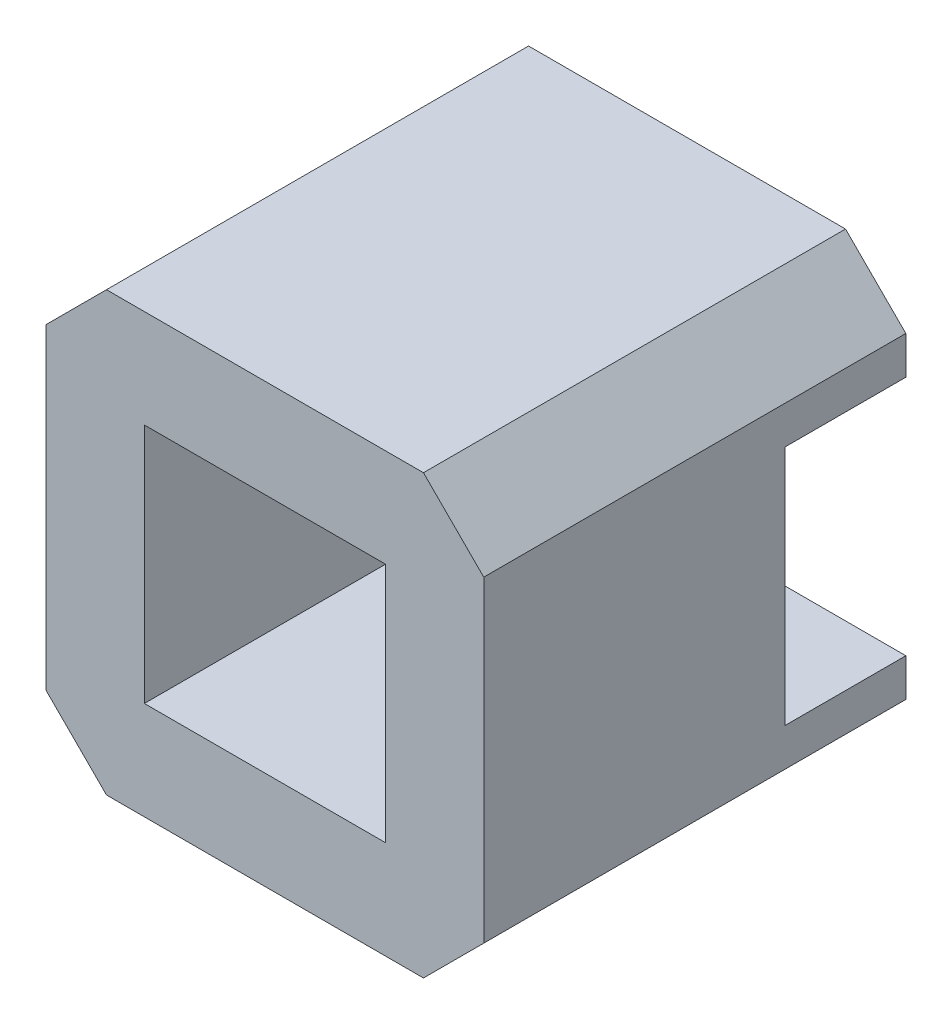
ISO-10303-21;
HEADER;
FILE_DESCRIPTION(('STEP AP214'),'2;1');
FILE_NAME('part.step','',(''),(''),'','','');
FILE_SCHEMA(('AUTOMOTIVE_DESIGN { 1 0 10303 214 1 1 1 1 }'));
ENDSEC;
DATA;
#1=APPLICATION_CONTEXT('core data for automotive mechanical design processes');
#2=APPLICATION_PROTOCOL_DEFINITION('international standard','automotive_design',2000,#1);
#3=PRODUCT_CONTEXT('',#1,'mechanical');
#4=PRODUCT('Part','Part','',(#3));
#5=PRODUCT_RELATED_PRODUCT_CATEGORY('part','',(#4));
#6=PRODUCT_DEFINITION_FORMATION('','',#4);
#7=PRODUCT_DEFINITION_CONTEXT('part definition',#1,'design');
#8=PRODUCT_DEFINITION('design','',#6,#7);
#9=PRODUCT_DEFINITION_SHAPE('','',#8);
#10=(LENGTH_UNIT() NAMED_UNIT(*) SI_UNIT(.MILLI.,.METRE.));
#11=(NAMED_UNIT(*) PLANE_ANGLE_UNIT() SI_UNIT($,.RADIAN.));
#12=(NAMED_UNIT(*) SI_UNIT($,.STERADIAN.) SOLID_ANGLE_UNIT());
#13=UNCERTAINTY_MEASURE_WITH_UNIT(LENGTH_MEASURE(1.E-05),#10,'distance_accuracy_value','');
#14=(GEOMETRIC_REPRESENTATION_CONTEXT(3) GLOBAL_UNCERTAINTY_ASSIGNED_CONTEXT((#13)) GLOBAL_UNIT_ASSIGNED_CONTEXT((#10,
#11,#12)) REPRESENTATION_CONTEXT('',''));
#15=CARTESIAN_POINT('',(0.,0.,0.));
#16=DIRECTION('',(0.,0.,1.));
#17=DIRECTION('',(1.,0.,0.));
#18=AXIS2_PLACEMENT_3D('',#15,#16,#17);
#19=CARTESIAN_POINT('',(-6.128826208725,29.409000078524,-11.75));
#20=DIRECTION('',(0.,0.,-1.));
#21=DIRECTION('',(0.,-1.,0.));
#22=AXIS2_PLACEMENT_3D('',#19,#20,#21);
#23=PLANE('',#22);
#24=DIRECTION('',(-1.,0.,0.));
#25=VECTOR('',#24,1.);
#26=CARTESIAN_POINT('',(-6.128826208725,28.709000078524,-11.75));
#27=LINE('',#26,#25);
#28=CARTESIAN_POINT('',(-4.858826208725,28.709000078524,-11.75));
#29=VERTEX_POINT('',#28);
#30=CARTESIAN_POINT('',(-5.428826208725,28.709000078524,-11.75));
#31=VERTEX_POINT('',#30);
#32=EDGE_CURVE('E181',#29,#31,#27,.T.);
#33=ORIENTED_EDGE('',*,*,#32,.T.);
#34=DIRECTION('',(0.,1.,0.));
#35=VECTOR('',#34,1.);
#36=CARTESIAN_POINT('',(-5.428826208725,29.409000078524,-11.75));
#37=LINE('',#36,#35);
#38=CARTESIAN_POINT('',(-5.428826208725,30.109000078524,-11.75));
#39=VERTEX_POINT('',#38);
#40=EDGE_CURVE('E217',#31,#39,#37,.T.);
#41=ORIENTED_EDGE('',*,*,#40,.T.);
#42=DIRECTION('',(-1.,0.,0.));
#43=VECTOR('',#42,1.);
#44=CARTESIAN_POINT('',(-6.128826208725,30.109000078524,-11.75));
#45=LINE('',#44,#43);
#46=CARTESIAN_POINT('',(-4.858826208725,30.109000078524,-11.75));
#47=VERTEX_POINT('',#46);
#48=EDGE_CURVE('E243',#47,#39,#45,.T.);
#49=ORIENTED_EDGE('',*,*,#48,.F.);
#50=DIRECTION('',(0.,-1.,0.));
#51=VECTOR('',#50,1.);
#52=CARTESIAN_POINT('',(-4.858826208725,29.409000078524,-11.75));
#53=LINE('',#52,#51);
#54=EDGE_CURVE('E250',#47,#29,#53,.T.);
#55=ORIENTED_EDGE('',*,*,#54,.T.);
#56=EDGE_LOOP('',(#33,#41,#49,#55));
#57=FACE_BOUND('',#56,.T.);
#58=ADVANCED_FACE('F17',(#57),#23,.T.);
#59=CARTESIAN_POINT('',(-6.128826208725,29.409000078524,-10.));
#60=DIRECTION('',(0.,0.,1.));
#61=DIRECTION('',(1.,0.,0.));
#62=AXIS2_PLACEMENT_3D('',#59,#60,#61);
#63=PLANE('',#62);
#64=DIRECTION('',(-1.,0.,0.));
#65=VECTOR('',#64,1.);
#66=CARTESIAN_POINT('',(-6.128826208725,30.679000078524,-10.));
#67=LINE('',#66,#65);
#68=CARTESIAN_POINT('',(-5.208826208725,30.679000078524,-10.));
#69=VERTEX_POINT('',#68);
#70=CARTESIAN_POINT('',(-7.048826208725,30.679000078524,-10.));
#71=VERTEX_POINT('',#70);
#72=EDGE_CURVE('E247',#69,#71,#67,.T.);
#73=ORIENTED_EDGE('',*,*,#72,.T.);
#74=DIRECTION('',(0.707106781186548,0.707106781186548,0.));
#75=VECTOR('',#74,1.);
#76=CARTESIAN_POINT('',(-7.223826208725,30.504000078524,-10.));
#77=LINE('',#76,#75);
#78=CARTESIAN_POINT('',(-7.398826208725,30.329000078524,-10.));
#79=VERTEX_POINT('',#78);
#80=EDGE_CURVE('E260',#79,#71,#77,.T.);
#81=ORIENTED_EDGE('',*,*,#80,.F.);
#82=DIRECTION('',(0.,-1.,0.));
#83=VECTOR('',#82,1.);
#84=CARTESIAN_POINT('',(-7.398826208725,29.409000078524,-10.));
#85=LINE('',#84,#83);
#86=CARTESIAN_POINT('',(-7.398826208725,28.489000078524,-10.));
#87=VERTEX_POINT('',#86);
#88=EDGE_CURVE('E251',#79,#87,#85,.T.);
#89=ORIENTED_EDGE('',*,*,#88,.T.);
#90=DIRECTION('',(0.707106781186548,-0.707106781186548,0.));
#91=VECTOR('',#90,1.);
#92=CARTESIAN_POINT('',(-7.223826208725,28.314000078524,-10.));
#93=LINE('',#92,#91);
#94=CARTESIAN_POINT('',(-7.048826208725,28.139000078524,-10.));
#95=VERTEX_POINT('',#94);
#96=EDGE_CURVE('E278',#87,#95,#93,.T.);
#97=ORIENTED_EDGE('',*,*,#96,.T.);
#98=DIRECTION('',(-1.,0.,0.));
#99=VECTOR('',#98,1.);
#100=CARTESIAN_POINT('',(-6.128826208725,28.139000078524,-10.));
#101=LINE('',#100,#99);
#102=CARTESIAN_POINT('',(-5.208826208725,28.139000078524,-10.));
#103=VERTEX_POINT('',#102);
#104=EDGE_CURVE('E334',#103,#95,#101,.T.);
#105=ORIENTED_EDGE('',*,*,#104,.F.);
#106=DIRECTION('',(-0.707106781186548,-0.707106781186548,0.));
#107=VECTOR('',#106,1.);
#108=CARTESIAN_POINT('',(-5.033826208725,28.314000078524,-10.));
#109=LINE('',#108,#107);
#110=CARTESIAN_POINT('',(-4.858826208725,28.489000078524,-10.));
#111=VERTEX_POINT('',#110);
#112=EDGE_CURVE('E231',#111,#103,#109,.T.);
#113=ORIENTED_EDGE('',*,*,#112,.F.);
#114=DIRECTION('',(0.,-1.,0.));
#115=VECTOR('',#114,1.);
#116=CARTESIAN_POINT('',(-4.858826208725,29.409000078524,-10.));
#117=LINE('',#116,#115);
#118=CARTESIAN_POINT('',(-4.858826208725,30.329000078524,-10.));
#119=VERTEX_POINT('',#118);
#120=EDGE_CURVE('E20',#119,#111,#117,.T.);
#121=ORIENTED_EDGE('',*,*,#120,.F.);
#122=DIRECTION('',(-0.707106781186548,0.707106781186548,0.));
#123=VECTOR('',#122,1.);
#124=CARTESIAN_POINT('',(-5.033826208725,30.504000078524,-10.));
#125=LINE('',#124,#123);
#126=EDGE_CURVE('E308',#119,#69,#125,.T.);
#127=ORIENTED_EDGE('',*,*,#126,.T.);
#128=EDGE_LOOP('',(#73,#81,#89,#97,#105,#113,#121,#127));
#129=FACE_BOUND('',#128,.T.);
#130=DIRECTION('',(-1.,0.,0.));
#131=VECTOR('',#130,1.);
#132=CARTESIAN_POINT('',(-6.128826208725,30.109000078524,-10.));
#133=LINE('',#132,#131);
#134=CARTESIAN_POINT('',(-5.428826208725,30.109000078524,-10.));
#135=VERTEX_POINT('',#134);
#136=CARTESIAN_POINT('',(-6.828826208725,30.109000078524,-10.));
#137=VERTEX_POINT('',#136);
#138=EDGE_CURVE('E239',#135,#137,#133,.T.);
#139=ORIENTED_EDGE('',*,*,#138,.F.);
#140=DIRECTION('',(0.,1.,0.));
#141=VECTOR('',#140,1.);
#142=CARTESIAN_POINT('',(-5.428826208725,29.409000078524,-10.));
#143=LINE('',#142,#141);
#144=CARTESIAN_POINT('',(-5.428826208725,28.709000078524,-10.));
#145=VERTEX_POINT('',#144);
#146=EDGE_CURVE('E175',#145,#135,#143,.T.);
#147=ORIENTED_EDGE('',*,*,#146,.F.);
#148=DIRECTION('',(-1.,0.,0.));
#149=VECTOR('',#148,1.);
#150=CARTESIAN_POINT('',(-6.128826208725,28.709000078524,-10.));
#151=LINE('',#150,#149);
#152=CARTESIAN_POINT('',(-6.828826208725,28.709000078524,-10.));
#153=VERTEX_POINT('',#152);
#154=EDGE_CURVE('E169',#145,#153,#151,.T.);
#155=ORIENTED_EDGE('',*,*,#154,.T.);
#156=DIRECTION('',(0.,1.,0.));
#157=VECTOR('',#156,1.);
#158=CARTESIAN_POINT('',(-6.828826208725,29.409000078524,-10.));
#159=LINE('',#158,#157);
#160=EDGE_CURVE('E172',#153,#137,#159,.T.);
#161=ORIENTED_EDGE('',*,*,#160,.T.);
#162=EDGE_LOOP('',(#139,#147,#155,#161));
#163=FACE_BOUND('',#162,.T.);
#164=ADVANCED_FACE('F171',(#129,#163),#63,.T.);
#165=CARTESIAN_POINT('',(-6.128826208725,29.409000078524,-12.45));
#166=DIRECTION('',(0.,0.,1.));
#167=DIRECTION('',(1.,0.,0.));
#168=AXIS2_PLACEMENT_3D('',#165,#166,#167);
#169=PLANE('',#168);
#170=DIRECTION('',(-1.,0.,0.));
#171=VECTOR('',#170,1.);
#172=CARTESIAN_POINT('',(-6.128826208725,28.709000078524,-12.45));
#173=LINE('',#172,#171);
#174=CARTESIAN_POINT('',(-4.858826208725,28.709000078524,-12.45));
#175=VERTEX_POINT('',#174);
#176=CARTESIAN_POINT('',(-7.398826208725,28.709000078524,-12.45));
#177=VERTEX_POINT('',#176);
#178=EDGE_CURVE('E257',#175,#177,#173,.T.);
#179=ORIENTED_EDGE('',*,*,#178,.F.);
#180=DIRECTION('',(0.,-1.,0.));
#181=VECTOR('',#180,1.);
#182=CARTESIAN_POINT('',(-4.858826208725,29.409000078524,-12.45));
#183=LINE('',#182,#181);
#184=CARTESIAN_POINT('',(-4.858826208725,28.489000078524,-12.45));
#185=VERTEX_POINT('',#184);
#186=EDGE_CURVE('E11',#175,#185,#183,.T.);
#187=ORIENTED_EDGE('',*,*,#186,.T.);
#188=DIRECTION('',(0.707106781186548,0.707106781186548,0.));
#189=VECTOR('',#188,1.);
#190=CARTESIAN_POINT('',(-4.858826208725,28.489000078524,-12.45));
#191=LINE('',#190,#189);
#192=CARTESIAN_POINT('',(-5.208826208725,28.139000078524,-12.45));
#193=VERTEX_POINT('',#192);
#194=EDGE_CURVE('E296',#193,#185,#191,.T.);
#195=ORIENTED_EDGE('',*,*,#194,.F.);
#196=DIRECTION('',(-1.,0.,0.));
#197=VECTOR('',#196,1.);
#198=CARTESIAN_POINT('',(-6.128826208725,28.139000078524,-12.45));
#199=LINE('',#198,#197);
#200=CARTESIAN_POINT('',(-7.048826208725,28.139000078524,-12.45));
#201=VERTEX_POINT('',#200);
#202=EDGE_CURVE('E331',#193,#201,#199,.T.);
#203=ORIENTED_EDGE('',*,*,#202,.T.);
#204=DIRECTION('',(-0.707106781186548,0.707106781186548,0.));
#205=VECTOR('',#204,1.);
#206=CARTESIAN_POINT('',(-7.048826208725,28.139000078524,-12.45));
#207=LINE('',#206,#205);
#208=CARTESIAN_POINT('',(-7.398826208725,28.489000078524,-12.45));
#209=VERTEX_POINT('',#208);
#210=EDGE_CURVE('E232',#201,#209,#207,.T.);
#211=ORIENTED_EDGE('',*,*,#210,.T.);
#212=DIRECTION('',(0.,-1.,0.));
#213=VECTOR('',#212,1.);
#214=CARTESIAN_POINT('',(-7.398826208725,29.409000078524,-12.45));
#215=LINE('',#214,#213);
#216=EDGE_CURVE('E337',#177,#209,#215,.T.);
#217=ORIENTED_EDGE('',*,*,#216,.F.);
#218=EDGE_LOOP('',(#179,#187,#195,#203,#211,#217));
#219=FACE_BOUND('',#218,.T.);
#220=ADVANCED_FACE('F368',(#219),#169,.F.);
#221=CARTESIAN_POINT('',(-4.858826208725,29.409000078524,-10.));
#222=DIRECTION('',(1.,0.,0.));
#223=DIRECTION('',(0.,1.,0.));
#224=AXIS2_PLACEMENT_3D('',#221,#222,#223);
#225=PLANE('',#224);
#226=ORIENTED_EDGE('',*,*,#54,.F.);
#227=DIRECTION('',(0.,0.,-1.));
#228=VECTOR('',#227,1.);
#229=CARTESIAN_POINT('',(-4.858826208725,30.109000078524,-11.75));
#230=LINE('',#229,#228);
#231=CARTESIAN_POINT('',(-4.858826208725,30.109000078524,-12.45));
#232=VERTEX_POINT('',#231);
#233=EDGE_CURVE('E238',#47,#232,#230,.T.);
#234=ORIENTED_EDGE('',*,*,#233,.T.);
#235=DIRECTION('',(0.,-1.,0.));
#236=VECTOR('',#235,1.);
#237=CARTESIAN_POINT('',(-4.858826208725,29.409000078524,-12.45));
#238=LINE('',#237,#236);
#239=CARTESIAN_POINT('',(-4.858826208725,30.329000078524,-12.45));
#240=VERTEX_POINT('',#239);
#241=EDGE_CURVE('E301',#240,#232,#238,.T.);
#242=ORIENTED_EDGE('',*,*,#241,.F.);
#243=DIRECTION('',(0.,0.,1.));
#244=VECTOR('',#243,1.);
#245=CARTESIAN_POINT('',(-4.858826208725,30.329000078524,-10.));
#246=LINE('',#245,#244);
#247=EDGE_CURVE('E311',#240,#119,#246,.T.);
#248=ORIENTED_EDGE('',*,*,#247,.T.);
#249=ORIENTED_EDGE('',*,*,#120,.T.);
#250=DIRECTION('',(0.,0.,-1.));
#251=VECTOR('',#250,1.);
#252=CARTESIAN_POINT('',(-4.858826208725,28.489000078524,-10.));
#253=LINE('',#252,#251);
#254=EDGE_CURVE('E300',#111,#185,#253,.T.);
#255=ORIENTED_EDGE('',*,*,#254,.T.);
#256=ORIENTED_EDGE('',*,*,#186,.F.);
#257=DIRECTION('',(0.,0.,-1.));
#258=VECTOR('',#257,1.);
#259=CARTESIAN_POINT('',(-4.858826208725,28.709000078524,-11.75));
#260=LINE('',#259,#258);
#261=EDGE_CURVE('E274',#29,#175,#260,.T.);
#262=ORIENTED_EDGE('',*,*,#261,.F.);
#263=EDGE_LOOP('',(#226,#234,#242,#248,#249,#255,#256,#262));
#264=FACE_BOUND('',#263,.T.);
#265=ADVANCED_FACE('F352',(#264),#225,.T.);
#266=CARTESIAN_POINT('',(-6.128826208725,30.679000078524,-10.));
#267=DIRECTION('',(0.,-1.,0.));
#268=DIRECTION('',(0.,0.,-1.));
#269=AXIS2_PLACEMENT_3D('',#266,#267,#268);
#270=PLANE('',#269);
#271=DIRECTION('',(-1.,0.,0.));
#272=VECTOR('',#271,1.);
#273=CARTESIAN_POINT('',(-6.128826208725,30.679000078524,-12.45));
#274=LINE('',#273,#272);
#275=CARTESIAN_POINT('',(-5.208826208725,30.679000078524,-12.45));
#276=VERTEX_POINT('',#275);
#277=CARTESIAN_POINT('',(-7.048826208725,30.679000078524,-12.45));
#278=VERTEX_POINT('',#277);
#279=EDGE_CURVE('E48',#276,#278,#274,.T.);
#280=ORIENTED_EDGE('',*,*,#279,.T.);
#281=DIRECTION('',(0.,0.,1.));
#282=VECTOR('',#281,1.);
#283=CARTESIAN_POINT('',(-7.048826208725,30.679000078524,-10.));
#284=LINE('',#283,#282);
#285=EDGE_CURVE('E264',#278,#71,#284,.T.);
#286=ORIENTED_EDGE('',*,*,#285,.T.);
#287=ORIENTED_EDGE('',*,*,#72,.F.);
#288=DIRECTION('',(0.,0.,-1.));
#289=VECTOR('',#288,1.);
#290=CARTESIAN_POINT('',(-5.208826208725,30.679000078524,-12.45));
#291=LINE('',#290,#289);
#292=EDGE_CURVE('E265',#69,#276,#291,.T.);
#293=ORIENTED_EDGE('',*,*,#292,.T.);
#294=EDGE_LOOP('',(#280,#286,#287,#293));
#295=FACE_BOUND('',#294,.T.);
#296=ADVANCED_FACE('F623',(#295),#270,.F.);
#297=CARTESIAN_POINT('',(-7.398826208725,29.409000078524,-10.));
#298=DIRECTION('',(1.,0.,0.));
#299=DIRECTION('',(0.,1.,0.));
#300=AXIS2_PLACEMENT_3D('',#297,#298,#299);
#301=PLANE('',#300);
#302=DIRECTION('',(0.,-1.,0.));
#303=VECTOR('',#302,1.);
#304=CARTESIAN_POINT('',(-7.398826208725,29.409000078524,-11.75));
#305=LINE('',#304,#303);
#306=CARTESIAN_POINT('',(-7.398826208725,30.109000078524,-11.75));
#307=VERTEX_POINT('',#306);
#308=CARTESIAN_POINT('',(-7.398826208725,28.709000078524,-11.75));
#309=VERTEX_POINT('',#308);
#310=EDGE_CURVE('E215',#307,#309,#305,.T.);
#311=ORIENTED_EDGE('',*,*,#310,.T.);
#312=DIRECTION('',(0.,0.,-1.));
#313=VECTOR('',#312,1.);
#314=CARTESIAN_POINT('',(-7.398826208725,28.709000078524,-11.75));
#315=LINE('',#314,#313);
#316=EDGE_CURVE('E182',#309,#177,#315,.T.);
#317=ORIENTED_EDGE('',*,*,#316,.T.);
#318=ORIENTED_EDGE('',*,*,#216,.T.);
#319=DIRECTION('',(0.,0.,1.));
#320=VECTOR('',#319,1.);
#321=CARTESIAN_POINT('',(-7.398826208725,28.489000078524,-10.));
#322=LINE('',#321,#320);
#323=EDGE_CURVE('E282',#209,#87,#322,.T.);
#324=ORIENTED_EDGE('',*,*,#323,.T.);
#325=ORIENTED_EDGE('',*,*,#88,.F.);
#326=DIRECTION('',(0.,0.,-1.));
#327=VECTOR('',#326,1.);
#328=CARTESIAN_POINT('',(-7.398826208725,30.329000078524,-10.));
#329=LINE('',#328,#327);
#330=CARTESIAN_POINT('',(-7.398826208725,30.329000078524,-12.45));
#331=VERTEX_POINT('',#330);
#332=EDGE_CURVE('E304',#79,#331,#329,.T.);
#333=ORIENTED_EDGE('',*,*,#332,.T.);
#334=DIRECTION('',(0.,-1.,0.));
#335=VECTOR('',#334,1.);
#336=CARTESIAN_POINT('',(-7.398826208725,29.409000078524,-12.45));
#337=LINE('',#336,#335);
#338=CARTESIAN_POINT('',(-7.398826208725,30.109000078524,-12.45));
#339=VERTEX_POINT('',#338);
#340=EDGE_CURVE('E38',#331,#339,#337,.T.);
#341=ORIENTED_EDGE('',*,*,#340,.T.);
#342=DIRECTION('',(0.,0.,-1.));
#343=VECTOR('',#342,1.);
#344=CARTESIAN_POINT('',(-7.398826208725,30.109000078524,-11.75));
#345=LINE('',#344,#343);
#346=EDGE_CURVE('E242',#307,#339,#345,.T.);
#347=ORIENTED_EDGE('',*,*,#346,.F.);
#348=EDGE_LOOP('',(#311,#317,#318,#324,#325,#333,#341,#347));
#349=FACE_BOUND('',#348,.T.);
#350=ADVANCED_FACE('F614',(#349),#301,.F.);
#351=CARTESIAN_POINT('',(-6.128826208725,28.139000078524,-10.));
#352=DIRECTION('',(0.,-1.,0.));
#353=DIRECTION('',(0.,0.,-1.));
#354=AXIS2_PLACEMENT_3D('',#351,#352,#353);
#355=PLANE('',#354);
#356=ORIENTED_EDGE('',*,*,#202,.F.);
#357=DIRECTION('',(0.,0.,1.));
#358=VECTOR('',#357,1.);
#359=CARTESIAN_POINT('',(-5.208826208725,28.139000078524,-10.));
#360=LINE('',#359,#358);
#361=EDGE_CURVE('E292',#193,#103,#360,.T.);
#362=ORIENTED_EDGE('',*,*,#361,.T.);
#363=ORIENTED_EDGE('',*,*,#104,.T.);
#364=DIRECTION('',(0.,0.,-1.));
#365=VECTOR('',#364,1.);
#366=CARTESIAN_POINT('',(-7.048826208725,28.139000078524,-12.45));
#367=LINE('',#366,#365);
#368=EDGE_CURVE('E227',#95,#201,#367,.T.);
#369=ORIENTED_EDGE('',*,*,#368,.T.);
#370=EDGE_LOOP('',(#356,#362,#363,#369));
#371=FACE_BOUND('',#370,.T.);
#372=ADVANCED_FACE('F364',(#371),#355,.T.);
#373=CARTESIAN_POINT('',(-6.128826208725,29.409000078524,-12.45));
#374=DIRECTION('',(0.,0.,1.));
#375=DIRECTION('',(1.,0.,0.));
#376=AXIS2_PLACEMENT_3D('',#373,#374,#375);
#377=PLANE('',#376);
#378=ORIENTED_EDGE('',*,*,#241,.T.);
#379=DIRECTION('',(-1.,0.,0.));
#380=VECTOR('',#379,1.);
#381=CARTESIAN_POINT('',(-6.128826208725,30.109000078524,-12.45));
#382=LINE('',#381,#380);
#383=EDGE_CURVE('E214',#232,#339,#382,.T.);
#384=ORIENTED_EDGE('',*,*,#383,.T.);
#385=ORIENTED_EDGE('',*,*,#340,.F.);
#386=DIRECTION('',(-0.707106781186548,-0.707106781186548,0.));
#387=VECTOR('',#386,1.);
#388=CARTESIAN_POINT('',(-7.398826208725,30.329000078524,-12.45));
#389=LINE('',#388,#387);
#390=EDGE_CURVE('E321',#278,#331,#389,.T.);
#391=ORIENTED_EDGE('',*,*,#390,.F.);
#392=ORIENTED_EDGE('',*,*,#279,.F.);
#393=DIRECTION('',(0.707106781186548,-0.707106781186548,0.));
#394=VECTOR('',#393,1.);
#395=CARTESIAN_POINT('',(-5.208826208725,30.679000078524,-12.45));
#396=LINE('',#395,#394);
#397=EDGE_CURVE('E271',#276,#240,#396,.T.);
#398=ORIENTED_EDGE('',*,*,#397,.T.);
#399=EDGE_LOOP('',(#378,#384,#385,#391,#392,#398));
#400=FACE_BOUND('',#399,.T.);
#401=ADVANCED_FACE('F597',(#400),#377,.F.);
#402=CARTESIAN_POINT('',(-7.398826208725,30.329000078524,-10.));
#403=DIRECTION('',(0.707106781186548,-0.707106781186548,0.));
#404=DIRECTION('',(0.,0.,-1.));
#405=AXIS2_PLACEMENT_3D('',#402,#403,#404);
#406=PLANE('',#405);
#407=ORIENTED_EDGE('',*,*,#80,.T.);
#408=ORIENTED_EDGE('',*,*,#285,.F.);
#409=ORIENTED_EDGE('',*,*,#390,.T.);
#410=ORIENTED_EDGE('',*,*,#332,.F.);
#411=EDGE_LOOP('',(#407,#408,#409,#410));
#412=FACE_BOUND('',#411,.T.);
#413=ADVANCED_FACE('F588',(#412),#406,.F.);
#414=CARTESIAN_POINT('',(-5.208826208725,30.679000078524,-10.));
#415=DIRECTION('',(0.707106781186548,0.707106781186548,0.));
#416=DIRECTION('',(0.,0.,-1.));
#417=AXIS2_PLACEMENT_3D('',#414,#415,#416);
#418=PLANE('',#417);
#419=ORIENTED_EDGE('',*,*,#126,.F.);
#420=ORIENTED_EDGE('',*,*,#247,.F.);
#421=ORIENTED_EDGE('',*,*,#397,.F.);
#422=ORIENTED_EDGE('',*,*,#292,.F.);
#423=EDGE_LOOP('',(#419,#420,#421,#422));
#424=FACE_BOUND('',#423,.T.);
#425=ADVANCED_FACE('F580',(#424),#418,.T.);
#426=CARTESIAN_POINT('',(-4.858826208725,28.489000078524,-10.));
#427=DIRECTION('',(-0.707106781186548,0.707106781186548,0.));
#428=DIRECTION('',(0.,0.,1.));
#429=AXIS2_PLACEMENT_3D('',#426,#427,#428);
#430=PLANE('',#429);
#431=ORIENTED_EDGE('',*,*,#112,.T.);
#432=ORIENTED_EDGE('',*,*,#361,.F.);
#433=ORIENTED_EDGE('',*,*,#194,.T.);
#434=ORIENTED_EDGE('',*,*,#254,.F.);
#435=EDGE_LOOP('',(#431,#432,#433,#434));
#436=FACE_BOUND('',#435,.T.);
#437=ADVANCED_FACE('F358',(#436),#430,.F.);
#438=CARTESIAN_POINT('',(-7.048826208725,28.139000078524,-10.));
#439=DIRECTION('',(-0.707106781186548,-0.707106781186548,0.));
#440=DIRECTION('',(-0.707106781186548,0.707106781186548,0.));
#441=AXIS2_PLACEMENT_3D('',#438,#439,#440);
#442=PLANE('',#441);
#443=ORIENTED_EDGE('',*,*,#96,.F.);
#444=ORIENTED_EDGE('',*,*,#323,.F.);
#445=ORIENTED_EDGE('',*,*,#210,.F.);
#446=ORIENTED_EDGE('',*,*,#368,.F.);
#447=EDGE_LOOP('',(#443,#444,#445,#446));
#448=FACE_BOUND('',#447,.T.);
#449=ADVANCED_FACE('F561',(#448),#442,.T.);
#450=CARTESIAN_POINT('',(-6.128826208725,28.709000078524,-11.75));
#451=DIRECTION('',(0.,-1.,0.));
#452=DIRECTION('',(0.,0.,-1.));
#453=AXIS2_PLACEMENT_3D('',#450,#451,#452);
#454=PLANE('',#453);
#455=ORIENTED_EDGE('',*,*,#178,.T.);
#456=ORIENTED_EDGE('',*,*,#316,.F.);
#457=DIRECTION('',(-1.,0.,0.));
#458=VECTOR('',#457,1.);
#459=CARTESIAN_POINT('',(-6.128826208725,28.709000078524,-11.75));
#460=LINE('',#459,#458);
#461=CARTESIAN_POINT('',(-6.828826208725,28.709000078524,-11.75));
#462=VERTEX_POINT('',#461);
#463=EDGE_CURVE('E196',#462,#309,#460,.T.);
#464=ORIENTED_EDGE('',*,*,#463,.F.);
#465=DIRECTION('',(0.,0.,-1.));
#466=VECTOR('',#465,1.);
#467=CARTESIAN_POINT('',(-6.828826208725,28.709000078524,-9.998));
#468=LINE('',#467,#466);
#469=EDGE_CURVE('E188',#153,#462,#468,.T.);
#470=ORIENTED_EDGE('',*,*,#469,.F.);
#471=ORIENTED_EDGE('',*,*,#154,.F.);
#472=DIRECTION('',(0.,0.,-1.));
#473=VECTOR('',#472,1.);
#474=CARTESIAN_POINT('',(-5.428826208725,28.709000078524,-9.998));
#475=LINE('',#474,#473);
#476=EDGE_CURVE('E221',#145,#31,#475,.T.);
#477=ORIENTED_EDGE('',*,*,#476,.T.);
#478=ORIENTED_EDGE('',*,*,#32,.F.);
#479=ORIENTED_EDGE('',*,*,#261,.T.);
#480=EDGE_LOOP('',(#455,#456,#464,#470,#471,#477,#478,#479));
#481=FACE_BOUND('',#480,.T.);
#482=ADVANCED_FACE('F194',(#481),#454,.F.);
#483=CARTESIAN_POINT('',(-6.128826208725,30.109000078524,-11.75));
#484=DIRECTION('',(0.,-1.,0.));
#485=DIRECTION('',(0.,0.,-1.));
#486=AXIS2_PLACEMENT_3D('',#483,#484,#485);
#487=PLANE('',#486);
#488=ORIENTED_EDGE('',*,*,#383,.F.);
#489=ORIENTED_EDGE('',*,*,#233,.F.);
#490=ORIENTED_EDGE('',*,*,#48,.T.);
#491=DIRECTION('',(0.,0.,-1.));
#492=VECTOR('',#491,1.);
#493=CARTESIAN_POINT('',(-5.428826208725,30.109000078524,-9.998));
#494=LINE('',#493,#492);
#495=EDGE_CURVE('E222',#135,#39,#494,.T.);
#496=ORIENTED_EDGE('',*,*,#495,.F.);
#497=ORIENTED_EDGE('',*,*,#138,.T.);
#498=DIRECTION('',(0.,0.,-1.));
#499=VECTOR('',#498,1.);
#500=CARTESIAN_POINT('',(-6.828826208725,30.109000078524,-9.998));
#501=LINE('',#500,#499);
#502=CARTESIAN_POINT('',(-6.828826208725,30.109000078524,-11.75));
#503=VERTEX_POINT('',#502);
#504=EDGE_CURVE('E190',#137,#503,#501,.T.);
#505=ORIENTED_EDGE('',*,*,#504,.T.);
#506=DIRECTION('',(-1.,0.,0.));
#507=VECTOR('',#506,1.);
#508=CARTESIAN_POINT('',(-6.128826208725,30.109000078524,-11.75));
#509=LINE('',#508,#507);
#510=EDGE_CURVE('E211',#503,#307,#509,.T.);
#511=ORIENTED_EDGE('',*,*,#510,.T.);
#512=ORIENTED_EDGE('',*,*,#346,.T.);
#513=EDGE_LOOP('',(#488,#489,#490,#496,#497,#505,#511,#512));
#514=FACE_BOUND('',#513,.T.);
#515=ADVANCED_FACE('F543',(#514),#487,.T.);
#516=CARTESIAN_POINT('',(-6.128826208725,29.409000078524,-11.75));
#517=DIRECTION('',(0.,0.,-1.));
#518=DIRECTION('',(0.,-1.,0.));
#519=AXIS2_PLACEMENT_3D('',#516,#517,#518);
#520=PLANE('',#519);
#521=DIRECTION('',(0.,1.,0.));
#522=VECTOR('',#521,1.);
#523=CARTESIAN_POINT('',(-6.828826208725,29.409000078524,-11.75));
#524=LINE('',#523,#522);
#525=EDGE_CURVE('E199',#462,#503,#524,.T.);
#526=ORIENTED_EDGE('',*,*,#525,.F.);
#527=ORIENTED_EDGE('',*,*,#463,.T.);
#528=ORIENTED_EDGE('',*,*,#310,.F.);
#529=ORIENTED_EDGE('',*,*,#510,.F.);
#530=EDGE_LOOP('',(#526,#527,#528,#529));
#531=FACE_BOUND('',#530,.T.);
#532=ADVANCED_FACE('F532',(#531),#520,.T.);
#533=CARTESIAN_POINT('',(-5.428826208725,29.409000078524,-9.998));
#534=DIRECTION('',(-1.,0.,0.));
#535=DIRECTION('',(0.,0.,1.));
#536=AXIS2_PLACEMENT_3D('',#533,#534,#535);
#537=PLANE('',#536);
#538=ORIENTED_EDGE('',*,*,#146,.T.);
#539=ORIENTED_EDGE('',*,*,#495,.T.);
#540=ORIENTED_EDGE('',*,*,#40,.F.);
#541=ORIENTED_EDGE('',*,*,#476,.F.);
#542=EDGE_LOOP('',(#538,#539,#540,#541));
#543=FACE_BOUND('',#542,.T.);
#544=ADVANCED_FACE('F375',(#543),#537,.T.);
#545=CARTESIAN_POINT('',(-6.828826208725,29.409000078524,-9.998));
#546=DIRECTION('',(-1.,0.,0.));
#547=DIRECTION('',(0.,0.,1.));
#548=AXIS2_PLACEMENT_3D('',#545,#546,#547);
#549=PLANE('',#548);
#550=ORIENTED_EDGE('',*,*,#469,.T.);
#551=ORIENTED_EDGE('',*,*,#525,.T.);
#552=ORIENTED_EDGE('',*,*,#504,.F.);
#553=ORIENTED_EDGE('',*,*,#160,.F.);
#554=EDGE_LOOP('',(#550,#551,#552,#553));
#555=FACE_BOUND('',#554,.T.);
#556=ADVANCED_FACE('F186',(#555),#549,.F.);
#557=CLOSED_SHELL('',(#58,#164,#220,#265,#296,#350,#372,#401,#413,#425,#437,#449,#482,#515,#532,
#544,#556));
#558=MANIFOLD_SOLID_BREP('B1',#557);
#559=ADVANCED_BREP_SHAPE_REPRESENTATION('',(#18,#558),#14);
#560=SHAPE_DEFINITION_REPRESENTATION(#9,#559);
ENDSEC;
END-ISO-10303-21;
